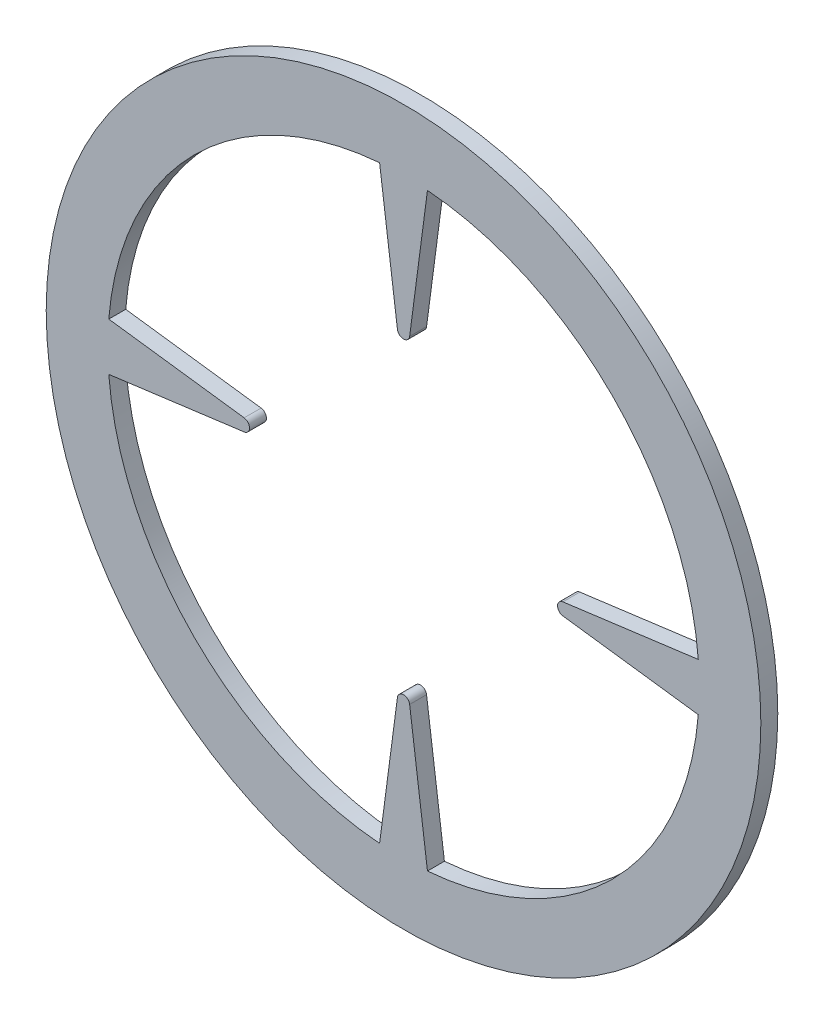
ISO-10303-21;
HEADER;
FILE_DESCRIPTION(('STEP AP214'),'2;1');
FILE_NAME('part.step','',(''),(''),'','','');
FILE_SCHEMA(('AUTOMOTIVE_DESIGN { 1 0 10303 214 1 1 1 1 }'));
ENDSEC;
DATA;
#1=APPLICATION_CONTEXT('core data for automotive mechanical design processes');
#2=APPLICATION_PROTOCOL_DEFINITION('international standard','automotive_design',2000,#1);
#3=PRODUCT_CONTEXT('',#1,'mechanical');
#4=PRODUCT('Part','Part','',(#3));
#5=PRODUCT_RELATED_PRODUCT_CATEGORY('part','',(#4));
#6=PRODUCT_DEFINITION_FORMATION('','',#4);
#7=PRODUCT_DEFINITION_CONTEXT('part definition',#1,'design');
#8=PRODUCT_DEFINITION('design','',#6,#7);
#9=PRODUCT_DEFINITION_SHAPE('','',#8);
#10=(LENGTH_UNIT() NAMED_UNIT(*) SI_UNIT(.MILLI.,.METRE.));
#11=(NAMED_UNIT(*) PLANE_ANGLE_UNIT() SI_UNIT($,.RADIAN.));
#12=(NAMED_UNIT(*) SI_UNIT($,.STERADIAN.) SOLID_ANGLE_UNIT());
#13=UNCERTAINTY_MEASURE_WITH_UNIT(LENGTH_MEASURE(1.E-05),#10,'distance_accuracy_value','');
#14=(GEOMETRIC_REPRESENTATION_CONTEXT(3) GLOBAL_UNCERTAINTY_ASSIGNED_CONTEXT((#13)) GLOBAL_UNIT_ASSIGNED_CONTEXT((#10,
#11,#12)) REPRESENTATION_CONTEXT('',''));
#15=CARTESIAN_POINT('',(0.,0.,0.));
#16=DIRECTION('',(0.,0.,1.));
#17=DIRECTION('',(1.,0.,0.));
#18=AXIS2_PLACEMENT_3D('',#15,#16,#17);
#19=CARTESIAN_POINT('',(0.,0.,0.055));
#20=DIRECTION('',(0.,0.,-1.));
#21=DIRECTION('',(-1.,0.,0.));
#22=AXIS2_PLACEMENT_3D('',#19,#20,#21);
#23=CYLINDRICAL_SURFACE('',#22,0.96);
#24=CARTESIAN_POINT('',(0.,0.,0.));
#25=DIRECTION('',(0.,0.,1.));
#26=DIRECTION('',(1.,0.,0.));
#27=AXIS2_PLACEMENT_3D('',#24,#25,#26);
#28=CIRCLE('',#27,0.96);
#29=CARTESIAN_POINT('',(-0.956851614400792,-0.0776851853225418,0.));
#30=VERTEX_POINT('',#29);
#31=CARTESIAN_POINT('',(-0.0776851853225584,-0.956851614400791,0.));
#32=VERTEX_POINT('',#31);
#33=EDGE_CURVE('E275',#30,#32,#28,.T.);
#34=ORIENTED_EDGE('',*,*,#33,.F.);
#35=DIRECTION('',(0.,0.,1.));
#36=VECTOR('',#35,1.);
#37=CARTESIAN_POINT('',(-0.956851614400792,-0.0776851853225418,0.));
#38=LINE('',#37,#36);
#39=CARTESIAN_POINT('',(-0.956851614400792,-0.0776851853225418,0.055));
#40=VERTEX_POINT('',#39);
#41=EDGE_CURVE('E58',#30,#40,#38,.T.);
#42=ORIENTED_EDGE('',*,*,#41,.T.);
#43=CARTESIAN_POINT('',(0.,0.,0.055));
#44=DIRECTION('',(0.,0.,1.));
#45=DIRECTION('',(1.,0.,0.));
#46=AXIS2_PLACEMENT_3D('',#43,#44,#45);
#47=CIRCLE('',#46,0.96);
#48=CARTESIAN_POINT('',(-0.0776851853225584,-0.956851614400791,0.055));
#49=VERTEX_POINT('',#48);
#50=EDGE_CURVE('E272',#40,#49,#47,.T.);
#51=ORIENTED_EDGE('',*,*,#50,.T.);
#52=DIRECTION('',(0.,0.,1.));
#53=VECTOR('',#52,1.);
#54=CARTESIAN_POINT('',(-0.0776851853225584,-0.956851614400791,0.));
#55=LINE('',#54,#53);
#56=EDGE_CURVE('E208',#32,#49,#55,.T.);
#57=ORIENTED_EDGE('',*,*,#56,.F.);
#58=EDGE_LOOP('',(#34,#42,#51,#57));
#59=FACE_BOUND('',#58,.T.);
#60=ADVANCED_FACE('F43',(#59),#23,.F.);
#61=CARTESIAN_POINT('',(0.0776851853225451,-0.956851614400792,0.));
#62=VERTEX_POINT('',#61);
#63=CARTESIAN_POINT('',(0.956851614400791,-0.0776851853225553,0.));
#64=VERTEX_POINT('',#63);
#65=EDGE_CURVE('E277',#62,#64,#28,.T.);
#66=ORIENTED_EDGE('',*,*,#65,.F.);
#67=DIRECTION('',(0.,0.,1.));
#68=VECTOR('',#67,1.);
#69=CARTESIAN_POINT('',(0.0776851853225451,-0.956851614400792,0.));
#70=LINE('',#69,#68);
#71=CARTESIAN_POINT('',(0.0776851853225451,-0.956851614400792,0.055));
#72=VERTEX_POINT('',#71);
#73=EDGE_CURVE('E66',#62,#72,#70,.T.);
#74=ORIENTED_EDGE('',*,*,#73,.T.);
#75=CARTESIAN_POINT('',(0.956851614400791,-0.0776851853225553,0.055));
#76=VERTEX_POINT('',#75);
#77=EDGE_CURVE('E276',#72,#76,#47,.T.);
#78=ORIENTED_EDGE('',*,*,#77,.T.);
#79=DIRECTION('',(0.,0.,1.));
#80=VECTOR('',#79,1.);
#81=CARTESIAN_POINT('',(0.956851614400791,-0.0776851853225553,0.));
#82=LINE('',#81,#80);
#83=EDGE_CURVE('E235',#64,#76,#82,.T.);
#84=ORIENTED_EDGE('',*,*,#83,.F.);
#85=EDGE_LOOP('',(#66,#74,#78,#84));
#86=FACE_BOUND('',#85,.T.);
#87=ADVANCED_FACE('F290',(#86),#23,.F.);
#88=CARTESIAN_POINT('',(0.956851614400791,0.0776851853225483,0.));
#89=VERTEX_POINT('',#88);
#90=CARTESIAN_POINT('',(0.0776851853225518,0.956851614400791,0.));
#91=VERTEX_POINT('',#90);
#92=EDGE_CURVE('E262',#89,#91,#28,.T.);
#93=ORIENTED_EDGE('',*,*,#92,.F.);
#94=DIRECTION('',(0.,0.,1.));
#95=VECTOR('',#94,1.);
#96=CARTESIAN_POINT('',(0.956851614400791,0.0776851853225483,0.));
#97=LINE('',#96,#95);
#98=CARTESIAN_POINT('',(0.956851614400791,0.0776851853225483,0.055));
#99=VERTEX_POINT('',#98);
#100=EDGE_CURVE('E231',#89,#99,#97,.T.);
#101=ORIENTED_EDGE('',*,*,#100,.T.);
#102=CARTESIAN_POINT('',(0.0776851853225518,0.956851614400791,0.055));
#103=VERTEX_POINT('',#102);
#104=EDGE_CURVE('E273',#99,#103,#47,.T.);
#105=ORIENTED_EDGE('',*,*,#104,.T.);
#106=DIRECTION('',(0.,0.,1.));
#107=VECTOR('',#106,1.);
#108=CARTESIAN_POINT('',(0.0776851853225518,0.956851614400791,0.));
#109=LINE('',#108,#107);
#110=EDGE_CURVE('E263',#91,#103,#109,.T.);
#111=ORIENTED_EDGE('',*,*,#110,.F.);
#112=EDGE_LOOP('',(#93,#101,#105,#111));
#113=FACE_BOUND('',#112,.T.);
#114=ADVANCED_FACE('F324',(#113),#23,.F.);
#115=DIRECTION('',(0.,0.,1.));
#116=VECTOR('',#115,1.);
#117=CARTESIAN_POINT('',(-0.956851614400791,0.0776851853225618,0.));
#118=LINE('',#117,#116);
#119=CARTESIAN_POINT('',(-0.956851614400791,0.0776851853225618,0.));
#120=VERTEX_POINT('',#119);
#121=CARTESIAN_POINT('',(-0.956851614400791,0.0776851853225618,0.055));
#122=VERTEX_POINT('',#121);
#123=EDGE_CURVE('E187',#120,#122,#118,.T.);
#124=ORIENTED_EDGE('',*,*,#123,.F.);
#125=CARTESIAN_POINT('',(-0.0776851853225518,0.956851614400791,0.));
#126=VERTEX_POINT('',#125);
#127=EDGE_CURVE('E274',#126,#120,#28,.T.);
#128=ORIENTED_EDGE('',*,*,#127,.F.);
#129=DIRECTION('',(0.,0.,1.));
#130=VECTOR('',#129,1.);
#131=CARTESIAN_POINT('',(-0.0776851853225518,0.956851614400791,0.));
#132=LINE('',#131,#130);
#133=CARTESIAN_POINT('',(-0.0776851853225518,0.956851614400791,0.055));
#134=VERTEX_POINT('',#133);
#135=EDGE_CURVE('E259',#126,#134,#132,.T.);
#136=ORIENTED_EDGE('',*,*,#135,.T.);
#137=EDGE_CURVE('E269',#134,#122,#47,.T.);
#138=ORIENTED_EDGE('',*,*,#137,.T.);
#139=EDGE_LOOP('',(#124,#128,#136,#138));
#140=FACE_BOUND('',#139,.T.);
#141=ADVANCED_FACE('F320',(#140),#23,.F.);
#142=CARTESIAN_POINT('',(0.,0.,0.055));
#143=DIRECTION('',(0.,0.,1.));
#144=DIRECTION('',(1.,0.,0.));
#145=AXIS2_PLACEMENT_3D('',#142,#143,#144);
#146=PLANE('',#145);
#147=CARTESIAN_POINT('',(0.,0.,0.055));
#148=DIRECTION('',(0.,0.,1.));
#149=DIRECTION('',(1.,0.,0.));
#150=AXIS2_PLACEMENT_3D('',#147,#148,#149);
#151=CIRCLE('',#150,1.16);
#152=CARTESIAN_POINT('',(1.16,0.,0.055));
#153=VERTEX_POINT('',#152);
#154=EDGE_CURVE('E11',#153,#153,#151,.T.);
#155=ORIENTED_EDGE('',*,*,#154,.T.);
#156=EDGE_LOOP('',(#155));
#157=FACE_BOUND('',#156,.T.);
#158=ORIENTED_EDGE('',*,*,#137,.F.);
#159=DIRECTION('',(-0.130526192220053,0.99144486137381,0.));
#160=VECTOR('',#159,1.);
#161=CARTESIAN_POINT('',(0.0474640544991815,0.00624876132044156,0.055));
#162=LINE('',#161,#160);
#163=CARTESIAN_POINT('',(-0.0198288972274744,0.517389476155599,0.055));
#164=VERTEX_POINT('',#163);
#165=EDGE_CURVE('E234',#164,#134,#162,.T.);
#166=ORIENTED_EDGE('',*,*,#165,.F.);
#167=CARTESIAN_POINT('',(0.,0.52,0.055));
#168=DIRECTION('',(0.,0.,1.));
#169=DIRECTION('',(1.,0.,0.));
#170=AXIS2_PLACEMENT_3D('',#167,#168,#169);
#171=CIRCLE('',#170,0.02);
#172=CARTESIAN_POINT('',(0.0198288972274762,0.517389476155599,0.055));
#173=VERTEX_POINT('',#172);
#174=EDGE_CURVE('E254',#164,#173,#171,.T.);
#175=ORIENTED_EDGE('',*,*,#174,.T.);
#176=DIRECTION('',(0.130526192220053,0.99144486137381,0.));
#177=VECTOR('',#176,1.);
#178=CARTESIAN_POINT('',(-0.0474640544991815,0.00624876132044156,0.055));
#179=LINE('',#178,#177);
#180=EDGE_CURVE('E245',#173,#103,#179,.T.);
#181=ORIENTED_EDGE('',*,*,#180,.T.);
#182=ORIENTED_EDGE('',*,*,#104,.F.);
#183=DIRECTION('',(0.991444861373811,0.130526192220049,0.));
#184=VECTOR('',#183,1.);
#185=CARTESIAN_POINT('',(0.0062487613204414,-0.0474640544991816,0.055));
#186=LINE('',#185,#184);
#187=CARTESIAN_POINT('',(0.517389476155599,0.0198288972274724,0.055));
#188=VERTEX_POINT('',#187);
#189=EDGE_CURVE('E207',#188,#99,#186,.T.);
#190=ORIENTED_EDGE('',*,*,#189,.F.);
#191=CARTESIAN_POINT('',(0.52,0.,0.055));
#192=DIRECTION('',(0.,0.,1.));
#193=DIRECTION('',(1.,0.,0.));
#194=AXIS2_PLACEMENT_3D('',#191,#192,#193);
#195=CIRCLE('',#194,0.02);
#196=CARTESIAN_POINT('',(0.517389476155599,-0.0198288972274781,0.055));
#197=VERTEX_POINT('',#196);
#198=EDGE_CURVE('E226',#188,#197,#195,.T.);
#199=ORIENTED_EDGE('',*,*,#198,.T.);
#200=DIRECTION('',(0.99144486137381,-0.130526192220056,0.));
#201=VECTOR('',#200,1.);
#202=CARTESIAN_POINT('',(0.00624876132044171,0.0474640544991813,0.055));
#203=LINE('',#202,#201);
#204=EDGE_CURVE('E218',#197,#76,#203,.T.);
#205=ORIENTED_EDGE('',*,*,#204,.T.);
#206=ORIENTED_EDGE('',*,*,#77,.F.);
#207=DIRECTION('',(0.130526192220046,-0.991444861373811,0.));
#208=VECTOR('',#207,1.);
#209=CARTESIAN_POINT('',(-0.0474640544991816,-0.00624876132044123,0.055));
#210=LINE('',#209,#208);
#211=CARTESIAN_POINT('',(0.0198288972274707,-0.517389476155599,0.055));
#212=VERTEX_POINT('',#211);
#213=EDGE_CURVE('E186',#212,#72,#210,.T.);
#214=ORIENTED_EDGE('',*,*,#213,.F.);
#215=CARTESIAN_POINT('',(0.,-0.52,0.055));
#216=DIRECTION('',(0.,0.,1.));
#217=DIRECTION('',(1.,0.,0.));
#218=AXIS2_PLACEMENT_3D('',#215,#216,#217);
#219=CIRCLE('',#218,0.02);
#220=CARTESIAN_POINT('',(-0.0198288972274798,-0.517389476155599,0.055));
#221=VERTEX_POINT('',#220);
#222=EDGE_CURVE('E201',#212,#221,#219,.T.);
#223=ORIENTED_EDGE('',*,*,#222,.T.);
#224=DIRECTION('',(-0.130526192220059,-0.991444861373809,0.));
#225=VECTOR('',#224,1.);
#226=CARTESIAN_POINT('',(0.0474640544991815,-0.0062487613204419,0.055));
#227=LINE('',#226,#225);
#228=EDGE_CURVE('E193',#221,#49,#227,.T.);
#229=ORIENTED_EDGE('',*,*,#228,.T.);
#230=ORIENTED_EDGE('',*,*,#50,.F.);
#231=DIRECTION('',(-0.991444861373812,-0.130526192220042,0.));
#232=VECTOR('',#231,1.);
#233=CARTESIAN_POINT('',(-0.00624876132044106,0.0474640544991815,0.055));
#234=LINE('',#233,#232);
#235=CARTESIAN_POINT('',(-0.517389476155599,-0.0198288972274689,0.055));
#236=VERTEX_POINT('',#235);
#237=EDGE_CURVE('E180',#236,#40,#234,.T.);
#238=ORIENTED_EDGE('',*,*,#237,.F.);
#239=CARTESIAN_POINT('',(-0.52,0.,0.055));
#240=DIRECTION('',(0.,0.,1.));
#241=DIRECTION('',(1.,0.,0.));
#242=AXIS2_PLACEMENT_3D('',#239,#240,#241);
#243=CIRCLE('',#242,0.02);
#244=CARTESIAN_POINT('',(-0.517389476155599,0.0198288972274816,0.055));
#245=VERTEX_POINT('',#244);
#246=EDGE_CURVE('E163',#236,#245,#243,.T.);
#247=ORIENTED_EDGE('',*,*,#246,.T.);
#248=DIRECTION('',(-0.991444861373809,0.130526192220063,0.));
#249=VECTOR('',#248,1.);
#250=CARTESIAN_POINT('',(-0.00624876132044206,-0.0474640544991814,0.055));
#251=LINE('',#250,#249);
#252=EDGE_CURVE('E172',#245,#122,#251,.T.);
#253=ORIENTED_EDGE('',*,*,#252,.T.);
#254=EDGE_LOOP('',(#158,#166,#175,#181,#182,#190,#199,#205,#206,#214,#223,#229,#230,#238,#247,#253));
#255=FACE_BOUND('',#254,.T.);
#256=ADVANCED_FACE('F301',(#157,#255),#146,.T.);
#257=CARTESIAN_POINT('',(0.,0.,0.));
#258=DIRECTION('',(0.,0.,1.));
#259=DIRECTION('',(1.,0.,0.));
#260=AXIS2_PLACEMENT_3D('',#257,#258,#259);
#261=PLANE('',#260);
#262=CARTESIAN_POINT('',(0.,0.,0.));
#263=DIRECTION('',(0.,0.,1.));
#264=DIRECTION('',(1.,0.,0.));
#265=AXIS2_PLACEMENT_3D('',#262,#263,#264);
#266=CIRCLE('',#265,1.16);
#267=CARTESIAN_POINT('',(1.16,0.,0.));
#268=VERTEX_POINT('',#267);
#269=EDGE_CURVE('E47',#268,#268,#266,.T.);
#270=ORIENTED_EDGE('',*,*,#269,.F.);
#271=EDGE_LOOP('',(#270));
#272=FACE_BOUND('',#271,.T.);
#273=ORIENTED_EDGE('',*,*,#127,.T.);
#274=DIRECTION('',(-0.991444861373809,0.130526192220063,0.));
#275=VECTOR('',#274,1.);
#276=CARTESIAN_POINT('',(-0.00624876132044206,-0.0474640544991814,0.));
#277=LINE('',#276,#275);
#278=CARTESIAN_POINT('',(-0.517389476155599,0.0198288972274816,0.));
#279=VERTEX_POINT('',#278);
#280=EDGE_CURVE('E166',#279,#120,#277,.T.);
#281=ORIENTED_EDGE('',*,*,#280,.F.);
#282=CARTESIAN_POINT('',(-0.52,0.,0.));
#283=DIRECTION('',(0.,0.,1.));
#284=DIRECTION('',(1.,0.,0.));
#285=AXIS2_PLACEMENT_3D('',#282,#283,#284);
#286=CIRCLE('',#285,0.02);
#287=CARTESIAN_POINT('',(-0.517389476155599,-0.0198288972274689,0.));
#288=VERTEX_POINT('',#287);
#289=EDGE_CURVE('E161',#288,#279,#286,.T.);
#290=ORIENTED_EDGE('',*,*,#289,.F.);
#291=DIRECTION('',(-0.991444861373812,-0.130526192220042,0.));
#292=VECTOR('',#291,1.);
#293=CARTESIAN_POINT('',(-0.00624876132044106,0.0474640544991815,0.));
#294=LINE('',#293,#292);
#295=EDGE_CURVE('E168',#288,#30,#294,.T.);
#296=ORIENTED_EDGE('',*,*,#295,.T.);
#297=ORIENTED_EDGE('',*,*,#33,.T.);
#298=DIRECTION('',(-0.130526192220059,-0.991444861373809,0.));
#299=VECTOR('',#298,1.);
#300=CARTESIAN_POINT('',(0.0474640544991815,-0.0062487613204419,0.));
#301=LINE('',#300,#299);
#302=CARTESIAN_POINT('',(-0.0198288972274798,-0.517389476155599,0.));
#303=VERTEX_POINT('',#302);
#304=EDGE_CURVE('E196',#303,#32,#301,.T.);
#305=ORIENTED_EDGE('',*,*,#304,.F.);
#306=CARTESIAN_POINT('',(0.,-0.52,0.));
#307=DIRECTION('',(0.,0.,1.));
#308=DIRECTION('',(1.,0.,0.));
#309=AXIS2_PLACEMENT_3D('',#306,#307,#308);
#310=CIRCLE('',#309,0.02);
#311=CARTESIAN_POINT('',(0.0198288972274707,-0.517389476155599,0.));
#312=VERTEX_POINT('',#311);
#313=EDGE_CURVE('E192',#312,#303,#310,.T.);
#314=ORIENTED_EDGE('',*,*,#313,.F.);
#315=DIRECTION('',(0.130526192220046,-0.991444861373811,0.));
#316=VECTOR('',#315,1.);
#317=CARTESIAN_POINT('',(-0.0474640544991816,-0.00624876132044123,0.));
#318=LINE('',#317,#316);
#319=EDGE_CURVE('E190',#312,#62,#318,.T.);
#320=ORIENTED_EDGE('',*,*,#319,.T.);
#321=ORIENTED_EDGE('',*,*,#65,.T.);
#322=DIRECTION('',(0.99144486137381,-0.130526192220056,0.));
#323=VECTOR('',#322,1.);
#324=CARTESIAN_POINT('',(0.00624876132044171,0.0474640544991813,0.));
#325=LINE('',#324,#323);
#326=CARTESIAN_POINT('',(0.517389476155599,-0.0198288972274781,0.));
#327=VERTEX_POINT('',#326);
#328=EDGE_CURVE('E221',#327,#64,#325,.T.);
#329=ORIENTED_EDGE('',*,*,#328,.F.);
#330=CARTESIAN_POINT('',(0.52,0.,0.));
#331=DIRECTION('',(0.,0.,1.));
#332=DIRECTION('',(1.,0.,0.));
#333=AXIS2_PLACEMENT_3D('',#330,#331,#332);
#334=CIRCLE('',#333,0.02);
#335=CARTESIAN_POINT('',(0.517389476155599,0.0198288972274724,0.));
#336=VERTEX_POINT('',#335);
#337=EDGE_CURVE('E217',#336,#327,#334,.T.);
#338=ORIENTED_EDGE('',*,*,#337,.F.);
#339=DIRECTION('',(0.991444861373811,0.130526192220049,0.));
#340=VECTOR('',#339,1.);
#341=CARTESIAN_POINT('',(0.0062487613204414,-0.0474640544991816,0.));
#342=LINE('',#341,#340);
#343=EDGE_CURVE('E214',#336,#89,#342,.T.);
#344=ORIENTED_EDGE('',*,*,#343,.T.);
#345=ORIENTED_EDGE('',*,*,#92,.T.);
#346=DIRECTION('',(0.130526192220053,0.99144486137381,0.));
#347=VECTOR('',#346,1.);
#348=CARTESIAN_POINT('',(-0.0474640544991815,0.00624876132044156,0.));
#349=LINE('',#348,#347);
#350=CARTESIAN_POINT('',(0.0198288972274762,0.517389476155599,0.));
#351=VERTEX_POINT('',#350);
#352=EDGE_CURVE('E248',#351,#91,#349,.T.);
#353=ORIENTED_EDGE('',*,*,#352,.F.);
#354=CARTESIAN_POINT('',(0.,0.52,0.));
#355=DIRECTION('',(0.,0.,1.));
#356=DIRECTION('',(1.,0.,0.));
#357=AXIS2_PLACEMENT_3D('',#354,#355,#356);
#358=CIRCLE('',#357,0.02);
#359=CARTESIAN_POINT('',(-0.0198288972274744,0.517389476155599,0.));
#360=VERTEX_POINT('',#359);
#361=EDGE_CURVE('E244',#360,#351,#358,.T.);
#362=ORIENTED_EDGE('',*,*,#361,.F.);
#363=DIRECTION('',(-0.130526192220053,0.99144486137381,0.));
#364=VECTOR('',#363,1.);
#365=CARTESIAN_POINT('',(0.0474640544991815,0.00624876132044156,0.));
#366=LINE('',#365,#364);
#367=EDGE_CURVE('E241',#360,#126,#366,.T.);
#368=ORIENTED_EDGE('',*,*,#367,.T.);
#369=EDGE_LOOP('',(#273,#281,#290,#296,#297,#305,#314,#320,#321,#329,#338,#344,#345,#353,#362,#368));
#370=FACE_BOUND('',#369,.T.);
#371=ADVANCED_FACE('F176',(#272,#370),#261,.F.);
#372=CARTESIAN_POINT('',(0.,0.,0.055));
#373=DIRECTION('',(0.,0.,-1.));
#374=DIRECTION('',(-1.,0.,0.));
#375=AXIS2_PLACEMENT_3D('',#372,#373,#374);
#376=CYLINDRICAL_SURFACE('',#375,1.16);
#377=ORIENTED_EDGE('',*,*,#154,.F.);
#378=EDGE_LOOP('',(#377));
#379=FACE_BOUND('',#378,.T.);
#380=ORIENTED_EDGE('',*,*,#269,.T.);
#381=EDGE_LOOP('',(#380));
#382=FACE_BOUND('',#381,.T.);
#383=ADVANCED_FACE('F45',(#379,#382),#376,.T.);
#384=CARTESIAN_POINT('',(0.0474640544991815,0.00624876132044156,0.));
#385=DIRECTION('',(0.99144486137381,0.130526192220053,0.));
#386=DIRECTION('',(-0.130526192220053,0.99144486137381,0.));
#387=AXIS2_PLACEMENT_3D('',#384,#385,#386);
#388=PLANE('',#387);
#389=ORIENTED_EDGE('',*,*,#165,.T.);
#390=ORIENTED_EDGE('',*,*,#135,.F.);
#391=ORIENTED_EDGE('',*,*,#367,.F.);
#392=DIRECTION('',(0.,0.,1.));
#393=VECTOR('',#392,1.);
#394=CARTESIAN_POINT('',(-0.0198288972274744,0.517389476155599,0.));
#395=LINE('',#394,#393);
#396=EDGE_CURVE('E251',#360,#164,#395,.T.);
#397=ORIENTED_EDGE('',*,*,#396,.T.);
#398=EDGE_LOOP('',(#389,#390,#391,#397));
#399=FACE_BOUND('',#398,.T.);
#400=ADVANCED_FACE('F344',(#399),#388,.F.);
#401=CARTESIAN_POINT('',(-0.0474640544991815,0.00624876132044156,0.));
#402=DIRECTION('',(0.99144486137381,-0.130526192220053,0.));
#403=DIRECTION('',(0.130526192220053,0.99144486137381,0.));
#404=AXIS2_PLACEMENT_3D('',#401,#402,#403);
#405=PLANE('',#404);
#406=ORIENTED_EDGE('',*,*,#180,.F.);
#407=DIRECTION('',(0.,0.,1.));
#408=VECTOR('',#407,1.);
#409=CARTESIAN_POINT('',(0.0198288972274762,0.517389476155599,0.));
#410=LINE('',#409,#408);
#411=EDGE_CURVE('E266',#351,#173,#410,.T.);
#412=ORIENTED_EDGE('',*,*,#411,.F.);
#413=ORIENTED_EDGE('',*,*,#352,.T.);
#414=ORIENTED_EDGE('',*,*,#110,.T.);
#415=EDGE_LOOP('',(#406,#412,#413,#414));
#416=FACE_BOUND('',#415,.T.);
#417=ADVANCED_FACE('F352',(#416),#405,.T.);
#418=CARTESIAN_POINT('',(0.,0.52,0.));
#419=DIRECTION('',(0.,0.,1.));
#420=DIRECTION('',(1.,0.,0.));
#421=AXIS2_PLACEMENT_3D('',#418,#419,#420);
#422=CYLINDRICAL_SURFACE('',#421,0.02);
#423=ORIENTED_EDGE('',*,*,#174,.F.);
#424=ORIENTED_EDGE('',*,*,#396,.F.);
#425=ORIENTED_EDGE('',*,*,#361,.T.);
#426=ORIENTED_EDGE('',*,*,#411,.T.);
#427=EDGE_LOOP('',(#423,#424,#425,#426));
#428=FACE_BOUND('',#427,.T.);
#429=ADVANCED_FACE('F347',(#428),#422,.T.);
#430=CARTESIAN_POINT('',(0.0062487613204414,-0.0474640544991816,0.));
#431=DIRECTION('',(0.130526192220049,-0.991444861373811,0.));
#432=DIRECTION('',(0.991444861373811,0.130526192220049,0.));
#433=AXIS2_PLACEMENT_3D('',#430,#431,#432);
#434=PLANE('',#433);
#435=ORIENTED_EDGE('',*,*,#189,.T.);
#436=ORIENTED_EDGE('',*,*,#100,.F.);
#437=ORIENTED_EDGE('',*,*,#343,.F.);
#438=DIRECTION('',(0.,0.,1.));
#439=VECTOR('',#438,1.);
#440=CARTESIAN_POINT('',(0.517389476155599,0.0198288972274724,0.));
#441=LINE('',#440,#439);
#442=EDGE_CURVE('E224',#336,#188,#441,.T.);
#443=ORIENTED_EDGE('',*,*,#442,.T.);
#444=EDGE_LOOP('',(#435,#436,#437,#443));
#445=FACE_BOUND('',#444,.T.);
#446=ADVANCED_FACE('F355',(#445),#434,.F.);
#447=CARTESIAN_POINT('',(0.00624876132044171,0.0474640544991813,0.));
#448=DIRECTION('',(-0.130526192220056,-0.99144486137381,0.));
#449=DIRECTION('',(0.99144486137381,-0.130526192220056,0.));
#450=AXIS2_PLACEMENT_3D('',#447,#448,#449);
#451=PLANE('',#450);
#452=ORIENTED_EDGE('',*,*,#204,.F.);
#453=DIRECTION('',(0.,0.,1.));
#454=VECTOR('',#453,1.);
#455=CARTESIAN_POINT('',(0.517389476155599,-0.0198288972274781,0.));
#456=LINE('',#455,#454);
#457=EDGE_CURVE('E238',#327,#197,#456,.T.);
#458=ORIENTED_EDGE('',*,*,#457,.F.);
#459=ORIENTED_EDGE('',*,*,#328,.T.);
#460=ORIENTED_EDGE('',*,*,#83,.T.);
#461=EDGE_LOOP('',(#452,#458,#459,#460));
#462=FACE_BOUND('',#461,.T.);
#463=ADVANCED_FACE('F289',(#462),#451,.T.);
#464=CARTESIAN_POINT('',(0.52,0.,0.));
#465=DIRECTION('',(0.,0.,1.));
#466=DIRECTION('',(1.,0.,0.));
#467=AXIS2_PLACEMENT_3D('',#464,#465,#466);
#468=CYLINDRICAL_SURFACE('',#467,0.02);
#469=ORIENTED_EDGE('',*,*,#198,.F.);
#470=ORIENTED_EDGE('',*,*,#442,.F.);
#471=ORIENTED_EDGE('',*,*,#337,.T.);
#472=ORIENTED_EDGE('',*,*,#457,.T.);
#473=EDGE_LOOP('',(#469,#470,#471,#472));
#474=FACE_BOUND('',#473,.T.);
#475=ADVANCED_FACE('F307',(#474),#468,.T.);
#476=CARTESIAN_POINT('',(-0.0474640544991816,-0.00624876132044123,0.));
#477=DIRECTION('',(-0.991444861373811,-0.130526192220046,0.));
#478=DIRECTION('',(0.130526192220046,-0.991444861373811,0.));
#479=AXIS2_PLACEMENT_3D('',#476,#477,#478);
#480=PLANE('',#479);
#481=ORIENTED_EDGE('',*,*,#213,.T.);
#482=ORIENTED_EDGE('',*,*,#73,.F.);
#483=ORIENTED_EDGE('',*,*,#319,.F.);
#484=DIRECTION('',(0.,0.,1.));
#485=VECTOR('',#484,1.);
#486=CARTESIAN_POINT('',(0.0198288972274707,-0.517389476155599,0.));
#487=LINE('',#486,#485);
#488=EDGE_CURVE('E199',#312,#212,#487,.T.);
#489=ORIENTED_EDGE('',*,*,#488,.T.);
#490=EDGE_LOOP('',(#481,#482,#483,#489));
#491=FACE_BOUND('',#490,.T.);
#492=ADVANCED_FACE('F305',(#491),#480,.F.);
#493=CARTESIAN_POINT('',(0.0474640544991815,-0.0062487613204419,0.));
#494=DIRECTION('',(-0.991444861373809,0.130526192220059,0.));
#495=DIRECTION('',(-0.130526192220059,-0.991444861373809,0.));
#496=AXIS2_PLACEMENT_3D('',#493,#494,#495);
#497=PLANE('',#496);
#498=ORIENTED_EDGE('',*,*,#228,.F.);
#499=DIRECTION('',(0.,0.,1.));
#500=VECTOR('',#499,1.);
#501=CARTESIAN_POINT('',(-0.0198288972274798,-0.517389476155599,0.));
#502=LINE('',#501,#500);
#503=EDGE_CURVE('E211',#303,#221,#502,.T.);
#504=ORIENTED_EDGE('',*,*,#503,.F.);
#505=ORIENTED_EDGE('',*,*,#304,.T.);
#506=ORIENTED_EDGE('',*,*,#56,.T.);
#507=EDGE_LOOP('',(#498,#504,#505,#506));
#508=FACE_BOUND('',#507,.T.);
#509=ADVANCED_FACE('F299',(#508),#497,.T.);
#510=CARTESIAN_POINT('',(0.,-0.52,0.));
#511=DIRECTION('',(0.,0.,1.));
#512=DIRECTION('',(1.,0.,0.));
#513=AXIS2_PLACEMENT_3D('',#510,#511,#512);
#514=CYLINDRICAL_SURFACE('',#513,0.02);
#515=ORIENTED_EDGE('',*,*,#222,.F.);
#516=ORIENTED_EDGE('',*,*,#488,.F.);
#517=ORIENTED_EDGE('',*,*,#313,.T.);
#518=ORIENTED_EDGE('',*,*,#503,.T.);
#519=EDGE_LOOP('',(#515,#516,#517,#518));
#520=FACE_BOUND('',#519,.T.);
#521=ADVANCED_FACE('F304',(#520),#514,.T.);
#522=CARTESIAN_POINT('',(-0.00624876132044106,0.0474640544991815,0.));
#523=DIRECTION('',(-0.130526192220042,0.991444861373812,0.));
#524=DIRECTION('',(-0.991444861373812,-0.130526192220042,0.));
#525=AXIS2_PLACEMENT_3D('',#522,#523,#524);
#526=PLANE('',#525);
#527=ORIENTED_EDGE('',*,*,#237,.T.);
#528=ORIENTED_EDGE('',*,*,#41,.F.);
#529=ORIENTED_EDGE('',*,*,#295,.F.);
#530=DIRECTION('',(0.,0.,1.));
#531=VECTOR('',#530,1.);
#532=CARTESIAN_POINT('',(-0.517389476155599,-0.0198288972274689,0.));
#533=LINE('',#532,#531);
#534=EDGE_CURVE('E158',#288,#236,#533,.T.);
#535=ORIENTED_EDGE('',*,*,#534,.T.);
#536=EDGE_LOOP('',(#527,#528,#529,#535));
#537=FACE_BOUND('',#536,.T.);
#538=ADVANCED_FACE('F169',(#537),#526,.F.);
#539=CARTESIAN_POINT('',(-0.00624876132044206,-0.0474640544991814,0.));
#540=DIRECTION('',(0.130526192220063,0.991444861373809,0.));
#541=DIRECTION('',(-0.991444861373809,0.130526192220063,0.));
#542=AXIS2_PLACEMENT_3D('',#539,#540,#541);
#543=PLANE('',#542);
#544=ORIENTED_EDGE('',*,*,#252,.F.);
#545=DIRECTION('',(0.,0.,1.));
#546=VECTOR('',#545,1.);
#547=CARTESIAN_POINT('',(-0.517389476155599,0.0198288972274816,0.));
#548=LINE('',#547,#546);
#549=EDGE_CURVE('E165',#279,#245,#548,.T.);
#550=ORIENTED_EDGE('',*,*,#549,.F.);
#551=ORIENTED_EDGE('',*,*,#280,.T.);
#552=ORIENTED_EDGE('',*,*,#123,.T.);
#553=EDGE_LOOP('',(#544,#550,#551,#552));
#554=FACE_BOUND('',#553,.T.);
#555=ADVANCED_FACE('F338',(#554),#543,.T.);
#556=CARTESIAN_POINT('',(-0.52,0.,0.));
#557=DIRECTION('',(0.,0.,1.));
#558=DIRECTION('',(1.,0.,0.));
#559=AXIS2_PLACEMENT_3D('',#556,#557,#558);
#560=CYLINDRICAL_SURFACE('',#559,0.02);
#561=ORIENTED_EDGE('',*,*,#246,.F.);
#562=ORIENTED_EDGE('',*,*,#534,.F.);
#563=ORIENTED_EDGE('',*,*,#289,.T.);
#564=ORIENTED_EDGE('',*,*,#549,.T.);
#565=EDGE_LOOP('',(#561,#562,#563,#564));
#566=FACE_BOUND('',#565,.T.);
#567=ADVANCED_FACE('F159',(#566),#560,.T.);
#568=CLOSED_SHELL('',(#60,#87,#114,#141,#256,#371,#383,#400,#417,#429,#446,#463,#475,#492,#509,
#521,#538,#555,#567));
#569=MANIFOLD_SOLID_BREP('B2',#568);
#570=ADVANCED_BREP_SHAPE_REPRESENTATION('',(#18,#569),#14);
#571=SHAPE_DEFINITION_REPRESENTATION(#9,#570);
ENDSEC;
END-ISO-10303-21;
